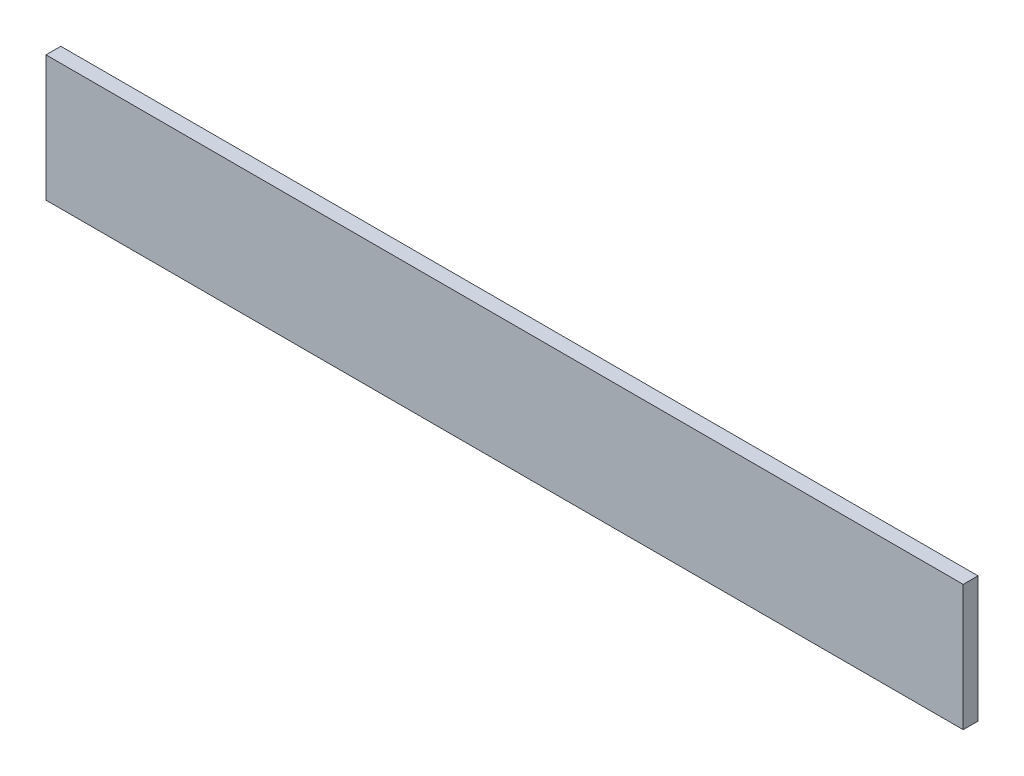
ISO-10303-21;
HEADER;
FILE_DESCRIPTION(('STEP AP214'),'2;1');
FILE_NAME('part.step','',(''),(''),'','','');
FILE_SCHEMA(('AUTOMOTIVE_DESIGN { 1 0 10303 214 1 1 1 1 }'));
ENDSEC;
DATA;
#1=APPLICATION_CONTEXT('core data for automotive mechanical design processes');
#2=APPLICATION_PROTOCOL_DEFINITION('international standard','automotive_design',2000,#1);
#3=PRODUCT_CONTEXT('',#1,'mechanical');
#4=PRODUCT('Part','Part','',(#3));
#5=PRODUCT_RELATED_PRODUCT_CATEGORY('part','',(#4));
#6=PRODUCT_DEFINITION_FORMATION('','',#4);
#7=PRODUCT_DEFINITION_CONTEXT('part definition',#1,'design');
#8=PRODUCT_DEFINITION('design','',#6,#7);
#9=PRODUCT_DEFINITION_SHAPE('','',#8);
#10=(LENGTH_UNIT() NAMED_UNIT(*) SI_UNIT(.MILLI.,.METRE.));
#11=(NAMED_UNIT(*) PLANE_ANGLE_UNIT() SI_UNIT($,.RADIAN.));
#12=(NAMED_UNIT(*) SI_UNIT($,.STERADIAN.) SOLID_ANGLE_UNIT());
#13=UNCERTAINTY_MEASURE_WITH_UNIT(LENGTH_MEASURE(1.E-05),#10,'distance_accuracy_value','');
#14=(GEOMETRIC_REPRESENTATION_CONTEXT(3) GLOBAL_UNCERTAINTY_ASSIGNED_CONTEXT((#13)) GLOBAL_UNIT_ASSIGNED_CONTEXT((#10,
#11,#12)) REPRESENTATION_CONTEXT('',''));
#15=CARTESIAN_POINT('',(0.,0.,0.));
#16=DIRECTION('',(0.,0.,1.));
#17=DIRECTION('',(1.,0.,0.));
#18=AXIS2_PLACEMENT_3D('',#15,#16,#17);
#19=CARTESIAN_POINT('',(0.,0.,0.));
#20=DIRECTION('',(0.,0.,1.));
#21=DIRECTION('',(1.,0.,0.));
#22=AXIS2_PLACEMENT_3D('',#19,#20,#21);
#23=PLANE('',#22);
#24=DIRECTION('',(0.,1.,0.));
#25=VECTOR('',#24,1.);
#26=CARTESIAN_POINT('',(309.7,42.5,0.));
#27=LINE('',#26,#25);
#28=CARTESIAN_POINT('',(309.7,-42.5,0.));
#29=VERTEX_POINT('',#28);
#30=CARTESIAN_POINT('',(309.7,42.5,0.));
#31=VERTEX_POINT('',#30);
#32=EDGE_CURVE('E137',#29,#31,#27,.T.);
#33=ORIENTED_EDGE('',*,*,#32,.F.);
#34=DIRECTION('',(1.,0.,0.));
#35=VECTOR('',#34,1.);
#36=CARTESIAN_POINT('',(-309.7,-42.5,0.));
#37=LINE('',#36,#35);
#38=CARTESIAN_POINT('',(-309.7,-42.5,0.));
#39=VERTEX_POINT('',#38);
#40=EDGE_CURVE('E85',#39,#29,#37,.T.);
#41=ORIENTED_EDGE('',*,*,#40,.F.);
#42=DIRECTION('',(0.,-1.,0.));
#43=VECTOR('',#42,1.);
#44=CARTESIAN_POINT('',(-309.7,42.5,0.));
#45=LINE('',#44,#43);
#46=CARTESIAN_POINT('',(-309.7,42.5,0.));
#47=VERTEX_POINT('',#46);
#48=EDGE_CURVE('E162',#47,#39,#45,.T.);
#49=ORIENTED_EDGE('',*,*,#48,.F.);
#50=DIRECTION('',(-1.,0.,0.));
#51=VECTOR('',#50,1.);
#52=CARTESIAN_POINT('',(-309.7,42.5,0.));
#53=LINE('',#52,#51);
#54=EDGE_CURVE('E143',#31,#47,#53,.T.);
#55=ORIENTED_EDGE('',*,*,#54,.F.);
#56=EDGE_LOOP('',(#33,#41,#49,#55));
#57=FACE_BOUND('',#56,.T.);
#58=DIRECTION('',(0.,1.,0.));
#59=VECTOR('',#58,1.);
#60=CARTESIAN_POINT('',(299.7,-32.95,0.));
#61=LINE('',#60,#59);
#62=CARTESIAN_POINT('',(299.7,-32.95,0.));
#63=VERTEX_POINT('',#62);
#64=CARTESIAN_POINT('',(299.7,32.95,0.));
#65=VERTEX_POINT('',#64);
#66=EDGE_CURVE('E55',#63,#65,#61,.T.);
#67=ORIENTED_EDGE('',*,*,#66,.T.);
#68=DIRECTION('',(-1.,0.,0.));
#69=VECTOR('',#68,1.);
#70=CARTESIAN_POINT('',(-299.7,32.95,0.));
#71=LINE('',#70,#69);
#72=CARTESIAN_POINT('',(-299.7,32.95,0.));
#73=VERTEX_POINT('',#72);
#74=EDGE_CURVE('E135',#65,#73,#71,.T.);
#75=ORIENTED_EDGE('',*,*,#74,.T.);
#76=DIRECTION('',(0.,-1.,0.));
#77=VECTOR('',#76,1.);
#78=CARTESIAN_POINT('',(-299.7,-32.95,0.));
#79=LINE('',#78,#77);
#80=CARTESIAN_POINT('',(-299.7,-32.95,0.));
#81=VERTEX_POINT('',#80);
#82=EDGE_CURVE('E282',#73,#81,#79,.T.);
#83=ORIENTED_EDGE('',*,*,#82,.T.);
#84=DIRECTION('',(1.,0.,0.));
#85=VECTOR('',#84,1.);
#86=CARTESIAN_POINT('',(-299.7,-32.95,0.));
#87=LINE('',#86,#85);
#88=EDGE_CURVE('E131',#81,#63,#87,.T.);
#89=ORIENTED_EDGE('',*,*,#88,.T.);
#90=EDGE_LOOP('',(#67,#75,#83,#89));
#91=FACE_BOUND('',#90,.T.);
#92=ADVANCED_FACE('F39',(#57,#91),#23,.F.);
#93=CARTESIAN_POINT('',(309.7,42.5,10.));
#94=DIRECTION('',(-1.,0.,0.));
#95=DIRECTION('',(0.,0.,1.));
#96=AXIS2_PLACEMENT_3D('',#93,#94,#95);
#97=PLANE('',#96);
#98=ORIENTED_EDGE('',*,*,#32,.T.);
#99=DIRECTION('',(0.,0.,-1.));
#100=VECTOR('',#99,1.);
#101=CARTESIAN_POINT('',(309.7,42.5,10.));
#102=LINE('',#101,#100);
#103=CARTESIAN_POINT('',(309.7,42.5,10.));
#104=VERTEX_POINT('',#103);
#105=EDGE_CURVE('E11',#104,#31,#102,.T.);
#106=ORIENTED_EDGE('',*,*,#105,.F.);
#107=DIRECTION('',(0.,1.,0.));
#108=VECTOR('',#107,1.);
#109=CARTESIAN_POINT('',(309.7,42.5,10.));
#110=LINE('',#109,#108);
#111=CARTESIAN_POINT('',(309.7,-42.5,10.));
#112=VERTEX_POINT('',#111);
#113=EDGE_CURVE('E149',#112,#104,#110,.T.);
#114=ORIENTED_EDGE('',*,*,#113,.F.);
#115=DIRECTION('',(0.,0.,-1.));
#116=VECTOR('',#115,1.);
#117=CARTESIAN_POINT('',(309.7,-42.5,10.));
#118=LINE('',#117,#116);
#119=EDGE_CURVE('E158',#112,#29,#118,.T.);
#120=ORIENTED_EDGE('',*,*,#119,.T.);
#121=EDGE_LOOP('',(#98,#106,#114,#120));
#122=FACE_BOUND('',#121,.T.);
#123=ADVANCED_FACE('F41',(#122),#97,.F.);
#124=CARTESIAN_POINT('',(-309.7,42.5,10.));
#125=DIRECTION('',(0.,-1.,0.));
#126=DIRECTION('',(0.,0.,-1.));
#127=AXIS2_PLACEMENT_3D('',#124,#125,#126);
#128=PLANE('',#127);
#129=ORIENTED_EDGE('',*,*,#54,.T.);
#130=DIRECTION('',(0.,0.,-1.));
#131=VECTOR('',#130,1.);
#132=CARTESIAN_POINT('',(-309.7,42.5,10.));
#133=LINE('',#132,#131);
#134=CARTESIAN_POINT('',(-309.7,42.5,10.));
#135=VERTEX_POINT('',#134);
#136=EDGE_CURVE('E48',#135,#47,#133,.T.);
#137=ORIENTED_EDGE('',*,*,#136,.F.);
#138=DIRECTION('',(-1.,0.,0.));
#139=VECTOR('',#138,1.);
#140=CARTESIAN_POINT('',(-309.7,42.5,10.));
#141=LINE('',#140,#139);
#142=EDGE_CURVE('E92',#104,#135,#141,.T.);
#143=ORIENTED_EDGE('',*,*,#142,.F.);
#144=ORIENTED_EDGE('',*,*,#105,.T.);
#145=EDGE_LOOP('',(#129,#137,#143,#144));
#146=FACE_BOUND('',#145,.T.);
#147=ADVANCED_FACE('F193',(#146),#128,.F.);
#148=CARTESIAN_POINT('',(-309.7,42.5,10.));
#149=DIRECTION('',(1.,0.,0.));
#150=DIRECTION('',(0.,0.,-1.));
#151=AXIS2_PLACEMENT_3D('',#148,#149,#150);
#152=PLANE('',#151);
#153=ORIENTED_EDGE('',*,*,#48,.T.);
#154=DIRECTION('',(0.,0.,-1.));
#155=VECTOR('',#154,1.);
#156=CARTESIAN_POINT('',(-309.7,-42.5,10.));
#157=LINE('',#156,#155);
#158=CARTESIAN_POINT('',(-309.7,-42.5,10.));
#159=VERTEX_POINT('',#158);
#160=EDGE_CURVE('E169',#159,#39,#157,.T.);
#161=ORIENTED_EDGE('',*,*,#160,.F.);
#162=DIRECTION('',(0.,-1.,0.));
#163=VECTOR('',#162,1.);
#164=CARTESIAN_POINT('',(-309.7,42.5,10.));
#165=LINE('',#164,#163);
#166=EDGE_CURVE('E154',#135,#159,#165,.T.);
#167=ORIENTED_EDGE('',*,*,#166,.F.);
#168=ORIENTED_EDGE('',*,*,#136,.T.);
#169=EDGE_LOOP('',(#153,#161,#167,#168));
#170=FACE_BOUND('',#169,.T.);
#171=ADVANCED_FACE('F176',(#170),#152,.F.);
#172=CARTESIAN_POINT('',(-309.7,-42.5,10.));
#173=DIRECTION('',(0.,1.,0.));
#174=DIRECTION('',(0.,0.,1.));
#175=AXIS2_PLACEMENT_3D('',#172,#173,#174);
#176=PLANE('',#175);
#177=ORIENTED_EDGE('',*,*,#40,.T.);
#178=ORIENTED_EDGE('',*,*,#119,.F.);
#179=DIRECTION('',(1.,0.,0.));
#180=VECTOR('',#179,1.);
#181=CARTESIAN_POINT('',(-309.7,-42.5,10.));
#182=LINE('',#181,#180);
#183=EDGE_CURVE('E64',#159,#112,#182,.T.);
#184=ORIENTED_EDGE('',*,*,#183,.F.);
#185=ORIENTED_EDGE('',*,*,#160,.T.);
#186=EDGE_LOOP('',(#177,#178,#184,#185));
#187=FACE_BOUND('',#186,.T.);
#188=ADVANCED_FACE('F184',(#187),#176,.F.);
#189=CARTESIAN_POINT('',(0.,0.,10.));
#190=DIRECTION('',(0.,0.,1.));
#191=DIRECTION('',(1.,0.,0.));
#192=AXIS2_PLACEMENT_3D('',#189,#190,#191);
#193=PLANE('',#192);
#194=ORIENTED_EDGE('',*,*,#113,.T.);
#195=ORIENTED_EDGE('',*,*,#142,.T.);
#196=ORIENTED_EDGE('',*,*,#166,.T.);
#197=ORIENTED_EDGE('',*,*,#183,.T.);
#198=EDGE_LOOP('',(#194,#195,#196,#197));
#199=FACE_BOUND('',#198,.T.);
#200=ADVANCED_FACE('F186',(#199),#193,.T.);
#201=CARTESIAN_POINT('',(299.7,-32.95,8.));
#202=DIRECTION('',(-1.,0.,0.));
#203=DIRECTION('',(0.,0.,1.));
#204=AXIS2_PLACEMENT_3D('',#201,#202,#203);
#205=PLANE('',#204);
#206=ORIENTED_EDGE('',*,*,#66,.F.);
#207=DIRECTION('',(0.,0.,-1.));
#208=VECTOR('',#207,1.);
#209=CARTESIAN_POINT('',(299.7,-32.95,8.));
#210=LINE('',#209,#208);
#211=CARTESIAN_POINT('',(299.7,-32.95,8.));
#212=VERTEX_POINT('',#211);
#213=EDGE_CURVE('E129',#212,#63,#210,.T.);
#214=ORIENTED_EDGE('',*,*,#213,.F.);
#215=DIRECTION('',(0.,1.,0.));
#216=VECTOR('',#215,1.);
#217=CARTESIAN_POINT('',(299.7,-32.95,8.));
#218=LINE('',#217,#216);
#219=CARTESIAN_POINT('',(299.7,32.95,8.));
#220=VERTEX_POINT('',#219);
#221=EDGE_CURVE('E120',#212,#220,#218,.T.);
#222=ORIENTED_EDGE('',*,*,#221,.T.);
#223=DIRECTION('',(0.,0.,-1.));
#224=VECTOR('',#223,1.);
#225=CARTESIAN_POINT('',(299.7,32.95,8.));
#226=LINE('',#225,#224);
#227=EDGE_CURVE('E128',#220,#65,#226,.T.);
#228=ORIENTED_EDGE('',*,*,#227,.T.);
#229=EDGE_LOOP('',(#206,#214,#222,#228));
#230=FACE_BOUND('',#229,.T.);
#231=ADVANCED_FACE('F127',(#230),#205,.T.);
#232=CARTESIAN_POINT('',(-299.7,32.95,8.));
#233=DIRECTION('',(0.,-1.,0.));
#234=DIRECTION('',(0.,0.,-1.));
#235=AXIS2_PLACEMENT_3D('',#232,#233,#234);
#236=PLANE('',#235);
#237=ORIENTED_EDGE('',*,*,#74,.F.);
#238=ORIENTED_EDGE('',*,*,#227,.F.);
#239=DIRECTION('',(-1.,0.,0.));
#240=VECTOR('',#239,1.);
#241=CARTESIAN_POINT('',(-299.7,32.95,8.));
#242=LINE('',#241,#240);
#243=CARTESIAN_POINT('',(-299.7,32.95,8.));
#244=VERTEX_POINT('',#243);
#245=EDGE_CURVE('E116',#220,#244,#242,.T.);
#246=ORIENTED_EDGE('',*,*,#245,.T.);
#247=DIRECTION('',(0.,0.,-1.));
#248=VECTOR('',#247,1.);
#249=CARTESIAN_POINT('',(-299.7,32.95,8.));
#250=LINE('',#249,#248);
#251=EDGE_CURVE('E138',#244,#73,#250,.T.);
#252=ORIENTED_EDGE('',*,*,#251,.T.);
#253=EDGE_LOOP('',(#237,#238,#246,#252));
#254=FACE_BOUND('',#253,.T.);
#255=ADVANCED_FACE('F133',(#254),#236,.T.);
#256=CARTESIAN_POINT('',(-299.7,-32.95,8.));
#257=DIRECTION('',(1.,0.,0.));
#258=DIRECTION('',(0.,0.,-1.));
#259=AXIS2_PLACEMENT_3D('',#256,#257,#258);
#260=PLANE('',#259);
#261=ORIENTED_EDGE('',*,*,#82,.F.);
#262=ORIENTED_EDGE('',*,*,#251,.F.);
#263=DIRECTION('',(0.,-1.,0.));
#264=VECTOR('',#263,1.);
#265=CARTESIAN_POINT('',(-299.7,-32.95,8.));
#266=LINE('',#265,#264);
#267=CARTESIAN_POINT('',(-299.7,-32.95,8.));
#268=VERTEX_POINT('',#267);
#269=EDGE_CURVE('E121',#244,#268,#266,.T.);
#270=ORIENTED_EDGE('',*,*,#269,.T.);
#271=DIRECTION('',(0.,0.,-1.));
#272=VECTOR('',#271,1.);
#273=CARTESIAN_POINT('',(-299.7,-32.95,8.));
#274=LINE('',#273,#272);
#275=EDGE_CURVE('E145',#268,#81,#274,.T.);
#276=ORIENTED_EDGE('',*,*,#275,.T.);
#277=EDGE_LOOP('',(#261,#262,#270,#276));
#278=FACE_BOUND('',#277,.T.);
#279=ADVANCED_FACE('F205',(#278),#260,.T.);
#280=CARTESIAN_POINT('',(-299.7,-32.95,8.));
#281=DIRECTION('',(0.,1.,0.));
#282=DIRECTION('',(0.,0.,1.));
#283=AXIS2_PLACEMENT_3D('',#280,#281,#282);
#284=PLANE('',#283);
#285=ORIENTED_EDGE('',*,*,#88,.F.);
#286=ORIENTED_EDGE('',*,*,#275,.F.);
#287=DIRECTION('',(1.,0.,0.));
#288=VECTOR('',#287,1.);
#289=CARTESIAN_POINT('',(-299.7,-32.95,8.));
#290=LINE('',#289,#288);
#291=EDGE_CURVE('E292',#268,#212,#290,.T.);
#292=ORIENTED_EDGE('',*,*,#291,.T.);
#293=ORIENTED_EDGE('',*,*,#213,.T.);
#294=EDGE_LOOP('',(#285,#286,#292,#293));
#295=FACE_BOUND('',#294,.T.);
#296=ADVANCED_FACE('F208',(#295),#284,.T.);
#297=CARTESIAN_POINT('',(0.,0.,8.));
#298=DIRECTION('',(0.,0.,-1.));
#299=DIRECTION('',(-1.,0.,0.));
#300=AXIS2_PLACEMENT_3D('',#297,#298,#299);
#301=PLANE('',#300);
#302=ORIENTED_EDGE('',*,*,#221,.F.);
#303=ORIENTED_EDGE('',*,*,#291,.F.);
#304=ORIENTED_EDGE('',*,*,#269,.F.);
#305=ORIENTED_EDGE('',*,*,#245,.F.);
#306=EDGE_LOOP('',(#302,#303,#304,#305));
#307=FACE_BOUND('',#306,.T.);
#308=ADVANCED_FACE('F118',(#307),#301,.T.);
#309=CLOSED_SHELL('',(#92,#123,#147,#171,#188,#200,#231,#255,#279,#296,#308));
#310=MANIFOLD_SOLID_BREP('B2',#309);
#311=ADVANCED_BREP_SHAPE_REPRESENTATION('',(#18,#310),#14);
#312=SHAPE_DEFINITION_REPRESENTATION(#9,#311);
ENDSEC;
END-ISO-10303-21;
